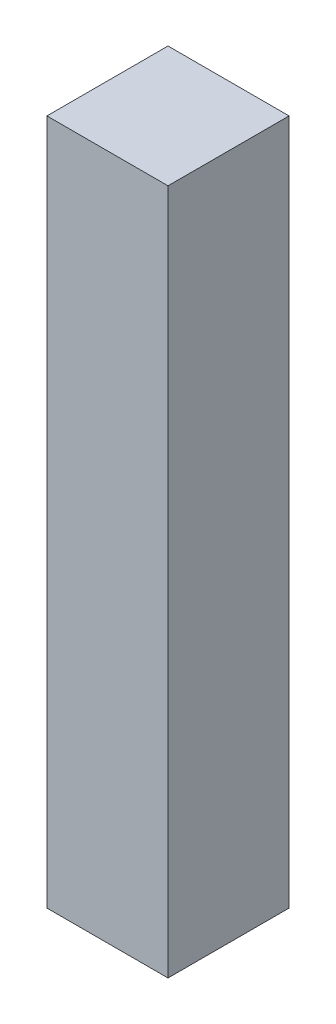
ISO-10303-21;
HEADER;
FILE_DESCRIPTION(('STEP AP214'),'2;1');
FILE_NAME('part.step','',(''),(''),'','','');
FILE_SCHEMA(('AUTOMOTIVE_DESIGN { 1 0 10303 214 1 1 1 1 }'));
ENDSEC;
DATA;
#1=APPLICATION_CONTEXT('core data for automotive mechanical design processes');
#2=APPLICATION_PROTOCOL_DEFINITION('international standard','automotive_design',2000,#1);
#3=PRODUCT_CONTEXT('',#1,'mechanical');
#4=PRODUCT('Part','Part','',(#3));
#5=PRODUCT_RELATED_PRODUCT_CATEGORY('part','',(#4));
#6=PRODUCT_DEFINITION_FORMATION('','',#4);
#7=PRODUCT_DEFINITION_CONTEXT('part definition',#1,'design');
#8=PRODUCT_DEFINITION('design','',#6,#7);
#9=PRODUCT_DEFINITION_SHAPE('','',#8);
#10=(LENGTH_UNIT() NAMED_UNIT(*) SI_UNIT(.MILLI.,.METRE.));
#11=(NAMED_UNIT(*) PLANE_ANGLE_UNIT() SI_UNIT($,.RADIAN.));
#12=(NAMED_UNIT(*) SI_UNIT($,.STERADIAN.) SOLID_ANGLE_UNIT());
#13=UNCERTAINTY_MEASURE_WITH_UNIT(LENGTH_MEASURE(1.E-05),#10,'distance_accuracy_value','');
#14=(GEOMETRIC_REPRESENTATION_CONTEXT(3) GLOBAL_UNCERTAINTY_ASSIGNED_CONTEXT((#13)) GLOBAL_UNIT_ASSIGNED_CONTEXT((#10,
#11,#12)) REPRESENTATION_CONTEXT('',''));
#15=CARTESIAN_POINT('',(0.,0.,0.));
#16=DIRECTION('',(0.,0.,1.));
#17=DIRECTION('',(1.,0.,0.));
#18=AXIS2_PLACEMENT_3D('',#15,#16,#17);
#19=CARTESIAN_POINT('',(-480.208333333333,1700.,-235.416666666667));
#20=DIRECTION('',(1.,0.,0.));
#21=DIRECTION('',(0.,0.,-1.));
#22=AXIS2_PLACEMENT_3D('',#19,#20,#21);
#23=PLANE('',#22);
#24=DIRECTION('',(0.,0.,1.));
#25=VECTOR('',#24,1.);
#26=CARTESIAN_POINT('',(-480.208333333333,0.,-235.416666666667));
#27=LINE('',#26,#25);
#28=CARTESIAN_POINT('',(-480.208333333333,0.,-235.416666666667));
#29=VERTEX_POINT('',#28);
#30=CARTESIAN_POINT('',(-480.208333333333,0.,64.5833333333334));
#31=VERTEX_POINT('',#30);
#32=EDGE_CURVE('E113',#29,#31,#27,.T.);
#33=ORIENTED_EDGE('',*,*,#32,.T.);
#34=DIRECTION('',(0.,-1.,0.));
#35=VECTOR('',#34,1.);
#36=CARTESIAN_POINT('',(-480.208333333333,1700.,64.5833333333334));
#37=LINE('',#36,#35);
#38=CARTESIAN_POINT('',(-480.208333333333,1700.,64.5833333333334));
#39=VERTEX_POINT('',#38);
#40=EDGE_CURVE('E11',#39,#31,#37,.T.);
#41=ORIENTED_EDGE('',*,*,#40,.F.);
#42=DIRECTION('',(0.,0.,1.));
#43=VECTOR('',#42,1.);
#44=CARTESIAN_POINT('',(-480.208333333333,1700.,-235.416666666667));
#45=LINE('',#44,#43);
#46=CARTESIAN_POINT('',(-480.208333333333,1700.,-235.416666666667));
#47=VERTEX_POINT('',#46);
#48=EDGE_CURVE('E97',#47,#39,#45,.T.);
#49=ORIENTED_EDGE('',*,*,#48,.F.);
#50=DIRECTION('',(0.,-1.,0.));
#51=VECTOR('',#50,1.);
#52=CARTESIAN_POINT('',(-480.208333333333,1700.,-235.416666666667));
#53=LINE('',#52,#51);
#54=EDGE_CURVE('E109',#47,#29,#53,.T.);
#55=ORIENTED_EDGE('',*,*,#54,.T.);
#56=EDGE_LOOP('',(#33,#41,#49,#55));
#57=FACE_BOUND('',#56,.T.);
#58=ADVANCED_FACE('F45',(#57),#23,.F.);
#59=CARTESIAN_POINT('',(-480.208333333333,1700.,64.5833333333334));
#60=DIRECTION('',(0.,0.,-1.));
#61=DIRECTION('',(-1.,0.,0.));
#62=AXIS2_PLACEMENT_3D('',#59,#60,#61);
#63=PLANE('',#62);
#64=DIRECTION('',(1.,0.,0.));
#65=VECTOR('',#64,1.);
#66=CARTESIAN_POINT('',(-480.208333333333,0.,64.5833333333334));
#67=LINE('',#66,#65);
#68=CARTESIAN_POINT('',(-180.208333333333,0.,64.5833333333334));
#69=VERTEX_POINT('',#68);
#70=EDGE_CURVE('E102',#31,#69,#67,.T.);
#71=ORIENTED_EDGE('',*,*,#70,.T.);
#72=DIRECTION('',(0.,-1.,0.));
#73=VECTOR('',#72,1.);
#74=CARTESIAN_POINT('',(-180.208333333333,1700.,64.5833333333334));
#75=LINE('',#74,#73);
#76=CARTESIAN_POINT('',(-180.208333333333,1700.,64.5833333333334));
#77=VERTEX_POINT('',#76);
#78=EDGE_CURVE('E54',#77,#69,#75,.T.);
#79=ORIENTED_EDGE('',*,*,#78,.F.);
#80=DIRECTION('',(1.,0.,0.));
#81=VECTOR('',#80,1.);
#82=CARTESIAN_POINT('',(-480.208333333333,1700.,64.5833333333334));
#83=LINE('',#82,#81);
#84=EDGE_CURVE('E92',#39,#77,#83,.T.);
#85=ORIENTED_EDGE('',*,*,#84,.F.);
#86=ORIENTED_EDGE('',*,*,#40,.T.);
#87=EDGE_LOOP('',(#71,#79,#85,#86));
#88=FACE_BOUND('',#87,.T.);
#89=ADVANCED_FACE('F101',(#88),#63,.F.);
#90=CARTESIAN_POINT('',(-180.208333333333,1700.,-235.416666666667));
#91=DIRECTION('',(-1.,0.,0.));
#92=DIRECTION('',(0.,0.,1.));
#93=AXIS2_PLACEMENT_3D('',#90,#91,#92);
#94=PLANE('',#93);
#95=DIRECTION('',(0.,0.,-1.));
#96=VECTOR('',#95,1.);
#97=CARTESIAN_POINT('',(-180.208333333333,0.,-235.416666666667));
#98=LINE('',#97,#96);
#99=CARTESIAN_POINT('',(-180.208333333333,0.,-235.416666666667));
#100=VERTEX_POINT('',#99);
#101=EDGE_CURVE('E79',#69,#100,#98,.T.);
#102=ORIENTED_EDGE('',*,*,#101,.T.);
#103=DIRECTION('',(0.,-1.,0.));
#104=VECTOR('',#103,1.);
#105=CARTESIAN_POINT('',(-180.208333333333,1700.,-235.416666666667));
#106=LINE('',#105,#104);
#107=CARTESIAN_POINT('',(-180.208333333333,1700.,-235.416666666667));
#108=VERTEX_POINT('',#107);
#109=EDGE_CURVE('E104',#108,#100,#106,.T.);
#110=ORIENTED_EDGE('',*,*,#109,.F.);
#111=DIRECTION('',(0.,0.,-1.));
#112=VECTOR('',#111,1.);
#113=CARTESIAN_POINT('',(-180.208333333333,1700.,-235.416666666667));
#114=LINE('',#113,#112);
#115=EDGE_CURVE('E95',#77,#108,#114,.T.);
#116=ORIENTED_EDGE('',*,*,#115,.F.);
#117=ORIENTED_EDGE('',*,*,#78,.T.);
#118=EDGE_LOOP('',(#102,#110,#116,#117));
#119=FACE_BOUND('',#118,.T.);
#120=ADVANCED_FACE('F105',(#119),#94,.F.);
#121=CARTESIAN_POINT('',(-480.208333333333,1700.,-235.416666666667));
#122=DIRECTION('',(0.,0.,1.));
#123=DIRECTION('',(1.,0.,0.));
#124=AXIS2_PLACEMENT_3D('',#121,#122,#123);
#125=PLANE('',#124);
#126=DIRECTION('',(-1.,0.,0.));
#127=VECTOR('',#126,1.);
#128=CARTESIAN_POINT('',(-480.208333333333,0.,-235.416666666667));
#129=LINE('',#128,#127);
#130=EDGE_CURVE('E85',#100,#29,#129,.T.);
#131=ORIENTED_EDGE('',*,*,#130,.T.);
#132=ORIENTED_EDGE('',*,*,#54,.F.);
#133=DIRECTION('',(-1.,0.,0.));
#134=VECTOR('',#133,1.);
#135=CARTESIAN_POINT('',(-480.208333333333,1700.,-235.416666666667));
#136=LINE('',#135,#134);
#137=EDGE_CURVE('E62',#108,#47,#136,.T.);
#138=ORIENTED_EDGE('',*,*,#137,.F.);
#139=ORIENTED_EDGE('',*,*,#109,.T.);
#140=EDGE_LOOP('',(#131,#132,#138,#139));
#141=FACE_BOUND('',#140,.T.);
#142=ADVANCED_FACE('F126',(#141),#125,.F.);
#143=CARTESIAN_POINT('',(0.,1700.,0.));
#144=DIRECTION('',(0.,1.,0.));
#145=DIRECTION('',(0.,0.,1.));
#146=AXIS2_PLACEMENT_3D('',#143,#144,#145);
#147=PLANE('',#146);
#148=ORIENTED_EDGE('',*,*,#48,.T.);
#149=ORIENTED_EDGE('',*,*,#84,.T.);
#150=ORIENTED_EDGE('',*,*,#115,.T.);
#151=ORIENTED_EDGE('',*,*,#137,.T.);
#152=EDGE_LOOP('',(#148,#149,#150,#151));
#153=FACE_BOUND('',#152,.T.);
#154=ADVANCED_FACE('F93',(#153),#147,.T.);
#155=CARTESIAN_POINT('',(0.,0.,0.));
#156=DIRECTION('',(0.,1.,0.));
#157=DIRECTION('',(0.,0.,1.));
#158=AXIS2_PLACEMENT_3D('',#155,#156,#157);
#159=PLANE('',#158);
#160=ORIENTED_EDGE('',*,*,#32,.F.);
#161=ORIENTED_EDGE('',*,*,#130,.F.);
#162=ORIENTED_EDGE('',*,*,#101,.F.);
#163=ORIENTED_EDGE('',*,*,#70,.F.);
#164=EDGE_LOOP('',(#160,#161,#162,#163));
#165=FACE_BOUND('',#164,.T.);
#166=ADVANCED_FACE('F129',(#165),#159,.F.);
#167=CLOSED_SHELL('',(#58,#89,#120,#142,#154,#166));
#168=MANIFOLD_SOLID_BREP('B2',#167);
#169=ADVANCED_BREP_SHAPE_REPRESENTATION('',(#18,#168),#14);
#170=SHAPE_DEFINITION_REPRESENTATION(#9,#169);
ENDSEC;
END-ISO-10303-21;
